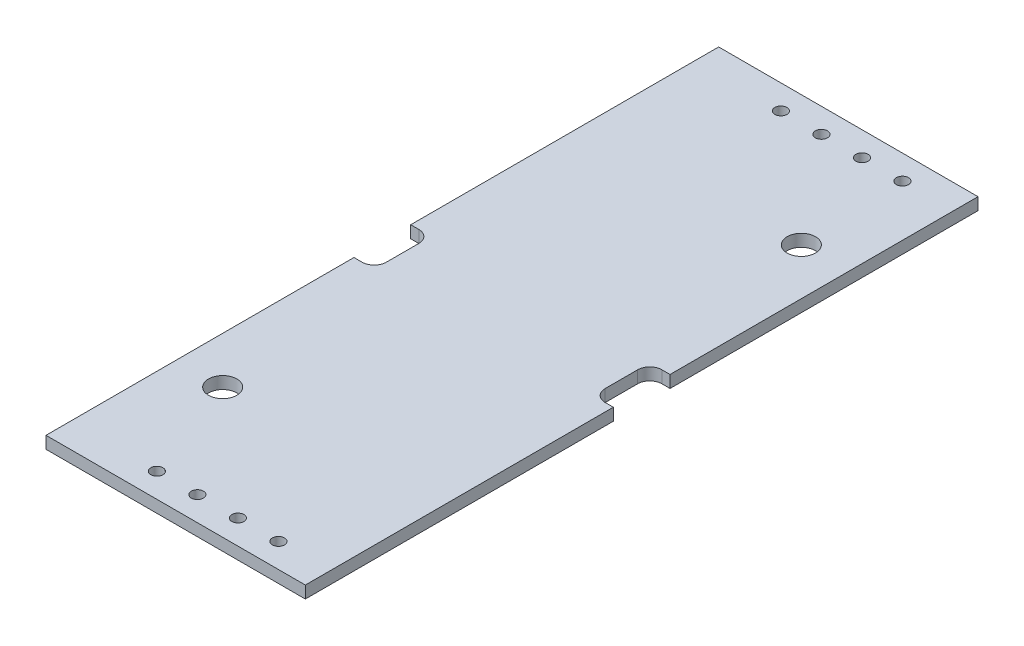
ISO-10303-21;
HEADER;
FILE_DESCRIPTION(('STEP AP214'),'2;1');
FILE_NAME('part.step','',(''),(''),'','','');
FILE_SCHEMA(('AUTOMOTIVE_DESIGN { 1 0 10303 214 1 1 1 1 }'));
ENDSEC;
DATA;
#1=APPLICATION_CONTEXT('core data for automotive mechanical design processes');
#2=APPLICATION_PROTOCOL_DEFINITION('international standard','automotive_design',2000,#1);
#3=PRODUCT_CONTEXT('',#1,'mechanical');
#4=PRODUCT('Part','Part','',(#3));
#5=PRODUCT_RELATED_PRODUCT_CATEGORY('part','',(#4));
#6=PRODUCT_DEFINITION_FORMATION('','',#4);
#7=PRODUCT_DEFINITION_CONTEXT('part definition',#1,'design');
#8=PRODUCT_DEFINITION('design','',#6,#7);
#9=PRODUCT_DEFINITION_SHAPE('','',#8);
#10=(LENGTH_UNIT() NAMED_UNIT(*) SI_UNIT(.MILLI.,.METRE.));
#11=(NAMED_UNIT(*) PLANE_ANGLE_UNIT() SI_UNIT($,.RADIAN.));
#12=(NAMED_UNIT(*) SI_UNIT($,.STERADIAN.) SOLID_ANGLE_UNIT());
#13=UNCERTAINTY_MEASURE_WITH_UNIT(LENGTH_MEASURE(1.E-05),#10,'distance_accuracy_value','');
#14=(GEOMETRIC_REPRESENTATION_CONTEXT(3) GLOBAL_UNCERTAINTY_ASSIGNED_CONTEXT((#13)) GLOBAL_UNIT_ASSIGNED_CONTEXT((#10,
#11,#12)) REPRESENTATION_CONTEXT('',''));
#15=CARTESIAN_POINT('',(0.,0.,0.));
#16=DIRECTION('',(0.,0.,1.));
#17=DIRECTION('',(1.,0.,0.));
#18=AXIS2_PLACEMENT_3D('',#15,#16,#17);
#19=CARTESIAN_POINT('',(-15.,0.,-2.));
#20=DIRECTION('',(0.,-1.,0.));
#21=DIRECTION('',(0.,0.,-1.));
#22=AXIS2_PLACEMENT_3D('',#19,#20,#21);
#23=PLANE('',#22);
#24=CARTESIAN_POINT('',(-5.32,0.,38.5));
#25=DIRECTION('',(0.,1.,0.));
#26=DIRECTION('',(0.,0.,1.));
#27=AXIS2_PLACEMENT_3D('',#24,#25,#26);
#28=CIRCLE('',#27,0.750000000000015);
#29=CARTESIAN_POINT('',(-5.32,0.,39.25));
#30=VERTEX_POINT('',#29);
#31=EDGE_CURVE('E356',#30,#30,#28,.T.);
#32=ORIENTED_EDGE('',*,*,#31,.T.);
#33=EDGE_LOOP('',(#32));
#34=FACE_BOUND('',#33,.T.);
#35=CARTESIAN_POINT('',(-0.320000000000001,0.,38.5));
#36=DIRECTION('',(0.,1.,0.));
#37=DIRECTION('',(0.,0.,1.));
#38=AXIS2_PLACEMENT_3D('',#35,#36,#37);
#39=CIRCLE('',#38,0.750000000000015);
#40=CARTESIAN_POINT('',(-0.320000000000001,0.,39.25));
#41=VERTEX_POINT('',#40);
#42=EDGE_CURVE('E360',#41,#41,#39,.T.);
#43=ORIENTED_EDGE('',*,*,#42,.T.);
#44=EDGE_LOOP('',(#43));
#45=FACE_BOUND('',#44,.T.);
#46=CARTESIAN_POINT('',(4.68,0.,38.5));
#47=DIRECTION('',(0.,1.,0.));
#48=DIRECTION('',(0.,0.,1.));
#49=AXIS2_PLACEMENT_3D('',#46,#47,#48);
#50=CIRCLE('',#49,0.750000000000015);
#51=CARTESIAN_POINT('',(4.68,0.,39.25));
#52=VERTEX_POINT('',#51);
#53=EDGE_CURVE('E369',#52,#52,#50,.T.);
#54=ORIENTED_EDGE('',*,*,#53,.T.);
#55=EDGE_LOOP('',(#54));
#56=FACE_BOUND('',#55,.T.);
#57=CARTESIAN_POINT('',(-5.32,0.,-38.5));
#58=DIRECTION('',(0.,1.,0.));
#59=DIRECTION('',(0.,0.,1.));
#60=AXIS2_PLACEMENT_3D('',#57,#58,#59);
#61=CIRCLE('',#60,0.750000000000015);
#62=CARTESIAN_POINT('',(-5.32,0.,-37.75));
#63=VERTEX_POINT('',#62);
#64=EDGE_CURVE('E375',#63,#63,#61,.T.);
#65=ORIENTED_EDGE('',*,*,#64,.T.);
#66=EDGE_LOOP('',(#65));
#67=FACE_BOUND('',#66,.T.);
#68=CARTESIAN_POINT('',(-0.320000000000001,0.,-38.5));
#69=DIRECTION('',(0.,1.,0.));
#70=DIRECTION('',(0.,0.,1.));
#71=AXIS2_PLACEMENT_3D('',#68,#69,#70);
#72=CIRCLE('',#71,0.750000000000015);
#73=CARTESIAN_POINT('',(-0.320000000000001,0.,-37.75));
#74=VERTEX_POINT('',#73);
#75=EDGE_CURVE('E381',#74,#74,#72,.T.);
#76=ORIENTED_EDGE('',*,*,#75,.T.);
#77=EDGE_LOOP('',(#76));
#78=FACE_BOUND('',#77,.T.);
#79=CARTESIAN_POINT('',(4.68,0.,-38.5));
#80=DIRECTION('',(0.,1.,0.));
#81=DIRECTION('',(0.,0.,1.));
#82=AXIS2_PLACEMENT_3D('',#79,#80,#81);
#83=CIRCLE('',#82,0.750000000000015);
#84=CARTESIAN_POINT('',(4.68,0.,-37.75));
#85=VERTEX_POINT('',#84);
#86=EDGE_CURVE('E387',#85,#85,#83,.T.);
#87=ORIENTED_EDGE('',*,*,#86,.T.);
#88=EDGE_LOOP('',(#87));
#89=FACE_BOUND('',#88,.T.);
#90=CARTESIAN_POINT('',(9.68,0.,-38.5));
#91=DIRECTION('',(0.,1.,0.));
#92=DIRECTION('',(0.,0.,1.));
#93=AXIS2_PLACEMENT_3D('',#90,#91,#92);
#94=CIRCLE('',#93,0.750000000000015);
#95=CARTESIAN_POINT('',(9.68,0.,-37.75));
#96=VERTEX_POINT('',#95);
#97=EDGE_CURVE('E396',#96,#96,#94,.T.);
#98=ORIENTED_EDGE('',*,*,#97,.T.);
#99=EDGE_LOOP('',(#98));
#100=FACE_BOUND('',#99,.T.);
#101=CARTESIAN_POINT('',(9.68,0.,38.5));
#102=DIRECTION('',(0.,1.,0.));
#103=DIRECTION('',(0.,0.,1.));
#104=AXIS2_PLACEMENT_3D('',#101,#102,#103);
#105=CIRCLE('',#104,0.750000000000015);
#106=CARTESIAN_POINT('',(9.68,0.,39.25));
#107=VERTEX_POINT('',#106);
#108=EDGE_CURVE('E402',#107,#107,#105,.T.);
#109=ORIENTED_EDGE('',*,*,#108,.T.);
#110=EDGE_LOOP('',(#109));
#111=FACE_BOUND('',#110,.T.);
#112=DIRECTION('',(0.,0.,1.));
#113=VECTOR('',#112,1.);
#114=CARTESIAN_POINT('',(-16.,0.,-41.5));
#115=LINE('',#114,#113);
#116=CARTESIAN_POINT('',(-16.,0.,-41.5));
#117=VERTEX_POINT('',#116);
#118=CARTESIAN_POINT('',(-16.,0.,-3.5));
#119=VERTEX_POINT('',#118);
#120=EDGE_CURVE('E175',#117,#119,#115,.T.);
#121=ORIENTED_EDGE('',*,*,#120,.F.);
#122=DIRECTION('',(-1.,0.,0.));
#123=VECTOR('',#122,1.);
#124=CARTESIAN_POINT('',(-16.,0.,-41.5));
#125=LINE('',#124,#123);
#126=CARTESIAN_POINT('',(16.,0.,-41.5));
#127=VERTEX_POINT('',#126);
#128=EDGE_CURVE('E106',#127,#117,#125,.T.);
#129=ORIENTED_EDGE('',*,*,#128,.F.);
#130=DIRECTION('',(0.,0.,-1.));
#131=VECTOR('',#130,1.);
#132=CARTESIAN_POINT('',(16.,0.,-41.5));
#133=LINE('',#132,#131);
#134=CARTESIAN_POINT('',(16.,0.,-3.5));
#135=VERTEX_POINT('',#134);
#136=EDGE_CURVE('E100',#135,#127,#133,.T.);
#137=ORIENTED_EDGE('',*,*,#136,.F.);
#138=DIRECTION('',(1.,0.,0.));
#139=VECTOR('',#138,1.);
#140=CARTESIAN_POINT('',(16.,0.,-3.5));
#141=LINE('',#140,#139);
#142=CARTESIAN_POINT('',(15.,0.,-3.5));
#143=VERTEX_POINT('',#142);
#144=EDGE_CURVE('E165',#143,#135,#141,.T.);
#145=ORIENTED_EDGE('',*,*,#144,.F.);
#146=CARTESIAN_POINT('',(15.,0.,-2.));
#147=DIRECTION('',(0.,-1.,0.));
#148=DIRECTION('',(0.,0.,1.));
#149=AXIS2_PLACEMENT_3D('',#146,#147,#148);
#150=CIRCLE('',#149,1.5);
#151=CARTESIAN_POINT('',(13.5,0.,-2.));
#152=VERTEX_POINT('',#151);
#153=EDGE_CURVE('E201',#152,#143,#150,.T.);
#154=ORIENTED_EDGE('',*,*,#153,.F.);
#155=DIRECTION('',(0.,0.,-1.));
#156=VECTOR('',#155,1.);
#157=CARTESIAN_POINT('',(13.5,0.,-2.));
#158=LINE('',#157,#156);
#159=CARTESIAN_POINT('',(13.5,0.,2.));
#160=VERTEX_POINT('',#159);
#161=EDGE_CURVE('E199',#160,#152,#158,.T.);
#162=ORIENTED_EDGE('',*,*,#161,.F.);
#163=CARTESIAN_POINT('',(15.,0.,2.));
#164=DIRECTION('',(0.,-1.,0.));
#165=DIRECTION('',(0.,0.,1.));
#166=AXIS2_PLACEMENT_3D('',#163,#164,#165);
#167=CIRCLE('',#166,1.5);
#168=CARTESIAN_POINT('',(15.,0.,3.5));
#169=VERTEX_POINT('',#168);
#170=EDGE_CURVE('E197',#169,#160,#167,.T.);
#171=ORIENTED_EDGE('',*,*,#170,.F.);
#172=DIRECTION('',(-1.,0.,0.));
#173=VECTOR('',#172,1.);
#174=CARTESIAN_POINT('',(15.,0.,3.5));
#175=LINE('',#174,#173);
#176=CARTESIAN_POINT('',(16.,0.,3.5));
#177=VERTEX_POINT('',#176);
#178=EDGE_CURVE('E195',#177,#169,#175,.T.);
#179=ORIENTED_EDGE('',*,*,#178,.F.);
#180=DIRECTION('',(0.,0.,-1.));
#181=VECTOR('',#180,1.);
#182=CARTESIAN_POINT('',(16.,0.,3.5));
#183=LINE('',#182,#181);
#184=CARTESIAN_POINT('',(16.,0.,41.5));
#185=VERTEX_POINT('',#184);
#186=EDGE_CURVE('E193',#185,#177,#183,.T.);
#187=ORIENTED_EDGE('',*,*,#186,.F.);
#188=DIRECTION('',(1.,0.,0.));
#189=VECTOR('',#188,1.);
#190=CARTESIAN_POINT('',(-16.,0.,41.5));
#191=LINE('',#190,#189);
#192=CARTESIAN_POINT('',(-16.,0.,41.5));
#193=VERTEX_POINT('',#192);
#194=EDGE_CURVE('E191',#193,#185,#191,.T.);
#195=ORIENTED_EDGE('',*,*,#194,.F.);
#196=DIRECTION('',(0.,0.,1.));
#197=VECTOR('',#196,1.);
#198=CARTESIAN_POINT('',(-16.,0.,3.5));
#199=LINE('',#198,#197);
#200=CARTESIAN_POINT('',(-16.,0.,3.5));
#201=VERTEX_POINT('',#200);
#202=EDGE_CURVE('E189',#201,#193,#199,.T.);
#203=ORIENTED_EDGE('',*,*,#202,.F.);
#204=DIRECTION('',(-1.,0.,0.));
#205=VECTOR('',#204,1.);
#206=CARTESIAN_POINT('',(-15.,0.,3.5));
#207=LINE('',#206,#205);
#208=CARTESIAN_POINT('',(-15.,0.,3.5));
#209=VERTEX_POINT('',#208);
#210=EDGE_CURVE('E187',#209,#201,#207,.T.);
#211=ORIENTED_EDGE('',*,*,#210,.F.);
#212=CARTESIAN_POINT('',(-15.,0.,2.));
#213=DIRECTION('',(0.,-1.,0.));
#214=DIRECTION('',(0.,0.,-1.));
#215=AXIS2_PLACEMENT_3D('',#212,#213,#214);
#216=CIRCLE('',#215,1.5);
#217=CARTESIAN_POINT('',(-13.5,0.,2.));
#218=VERTEX_POINT('',#217);
#219=EDGE_CURVE('E185',#218,#209,#216,.T.);
#220=ORIENTED_EDGE('',*,*,#219,.F.);
#221=DIRECTION('',(0.,0.,1.));
#222=VECTOR('',#221,1.);
#223=CARTESIAN_POINT('',(-13.5,0.,-2.));
#224=LINE('',#223,#222);
#225=CARTESIAN_POINT('',(-13.5,0.,-2.));
#226=VERTEX_POINT('',#225);
#227=EDGE_CURVE('E183',#226,#218,#224,.T.);
#228=ORIENTED_EDGE('',*,*,#227,.F.);
#229=CARTESIAN_POINT('',(-15.,0.,-2.));
#230=DIRECTION('',(0.,-1.,0.));
#231=DIRECTION('',(0.,0.,-1.));
#232=AXIS2_PLACEMENT_3D('',#229,#230,#231);
#233=CIRCLE('',#232,1.5);
#234=CARTESIAN_POINT('',(-15.,0.,-3.5));
#235=VERTEX_POINT('',#234);
#236=EDGE_CURVE('E181',#235,#226,#233,.T.);
#237=ORIENTED_EDGE('',*,*,#236,.F.);
#238=DIRECTION('',(1.,0.,0.));
#239=VECTOR('',#238,1.);
#240=CARTESIAN_POINT('',(-16.,0.,-3.5));
#241=LINE('',#240,#239);
#242=EDGE_CURVE('E178',#119,#235,#241,.T.);
#243=ORIENTED_EDGE('',*,*,#242,.F.);
#244=EDGE_LOOP('',(#121,#129,#137,#145,#154,#162,#171,#179,#187,#195,#203,#211,#220,#228,#237,#243));
#245=FACE_BOUND('',#244,.T.);
#246=CARTESIAN_POINT('',(-10.25,0.,25.45));
#247=DIRECTION('',(0.,1.,0.));
#248=DIRECTION('',(0.,0.,1.));
#249=AXIS2_PLACEMENT_3D('',#246,#247,#248);
#250=CIRCLE('',#249,1.75000000000001);
#251=CARTESIAN_POINT('',(-10.25,0.,27.2));
#252=VERTEX_POINT('',#251);
#253=EDGE_CURVE('E179',#252,#252,#250,.T.);
#254=ORIENTED_EDGE('',*,*,#253,.T.);
#255=EDGE_LOOP('',(#254));
#256=FACE_BOUND('',#255,.T.);
#257=CARTESIAN_POINT('',(10.25,0.,-25.45));
#258=DIRECTION('',(0.,1.,0.));
#259=DIRECTION('',(0.,0.,1.));
#260=AXIS2_PLACEMENT_3D('',#257,#258,#259);
#261=CIRCLE('',#260,1.75000000000001);
#262=CARTESIAN_POINT('',(10.25,0.,-23.7));
#263=VERTEX_POINT('',#262);
#264=EDGE_CURVE('E408',#263,#263,#261,.T.);
#265=ORIENTED_EDGE('',*,*,#264,.T.);
#266=EDGE_LOOP('',(#265));
#267=FACE_BOUND('',#266,.T.);
#268=ADVANCED_FACE('F30',(#34,#45,#56,#67,#78,#89,#100,#111,#245,#256,#267),#23,.T.);
#269=CARTESIAN_POINT('',(-16.,1.5,-41.5));
#270=DIRECTION('',(1.,0.,0.));
#271=DIRECTION('',(0.,0.,-1.));
#272=AXIS2_PLACEMENT_3D('',#269,#270,#271);
#273=PLANE('',#272);
#274=ORIENTED_EDGE('',*,*,#120,.T.);
#275=DIRECTION('',(0.,-1.,0.));
#276=VECTOR('',#275,1.);
#277=CARTESIAN_POINT('',(-16.,1.5,-3.5));
#278=LINE('',#277,#276);
#279=CARTESIAN_POINT('',(-16.,1.5,-3.5));
#280=VERTEX_POINT('',#279);
#281=EDGE_CURVE('E11',#280,#119,#278,.T.);
#282=ORIENTED_EDGE('',*,*,#281,.F.);
#283=DIRECTION('',(0.,0.,1.));
#284=VECTOR('',#283,1.);
#285=CARTESIAN_POINT('',(-16.,1.5,-41.5));
#286=LINE('',#285,#284);
#287=CARTESIAN_POINT('',(-16.,1.5,-41.5));
#288=VERTEX_POINT('',#287);
#289=EDGE_CURVE('E206',#288,#280,#286,.T.);
#290=ORIENTED_EDGE('',*,*,#289,.F.);
#291=DIRECTION('',(0.,-1.,0.));
#292=VECTOR('',#291,1.);
#293=CARTESIAN_POINT('',(-16.,1.5,-41.5));
#294=LINE('',#293,#292);
#295=EDGE_CURVE('E171',#288,#117,#294,.T.);
#296=ORIENTED_EDGE('',*,*,#295,.T.);
#297=EDGE_LOOP('',(#274,#282,#290,#296));
#298=FACE_BOUND('',#297,.T.);
#299=ADVANCED_FACE('F32',(#298),#273,.F.);
#300=CARTESIAN_POINT('',(-16.,1.5,-3.5));
#301=DIRECTION('',(0.,0.,-1.));
#302=DIRECTION('',(-1.,0.,0.));
#303=AXIS2_PLACEMENT_3D('',#300,#301,#302);
#304=PLANE('',#303);
#305=ORIENTED_EDGE('',*,*,#242,.T.);
#306=DIRECTION('',(0.,-1.,0.));
#307=VECTOR('',#306,1.);
#308=CARTESIAN_POINT('',(-15.,1.5,-3.5));
#309=LINE('',#308,#307);
#310=CARTESIAN_POINT('',(-15.,1.5,-3.5));
#311=VERTEX_POINT('',#310);
#312=EDGE_CURVE('E39',#311,#235,#309,.T.);
#313=ORIENTED_EDGE('',*,*,#312,.F.);
#314=DIRECTION('',(1.,0.,0.));
#315=VECTOR('',#314,1.);
#316=CARTESIAN_POINT('',(-16.,1.5,-3.5));
#317=LINE('',#316,#315);
#318=EDGE_CURVE('E114',#280,#311,#317,.T.);
#319=ORIENTED_EDGE('',*,*,#318,.F.);
#320=ORIENTED_EDGE('',*,*,#281,.T.);
#321=EDGE_LOOP('',(#305,#313,#319,#320));
#322=FACE_BOUND('',#321,.T.);
#323=ADVANCED_FACE('F310',(#322),#304,.F.);
#324=CARTESIAN_POINT('',(-15.,1.5,-2.));
#325=DIRECTION('',(0.,-1.,0.));
#326=DIRECTION('',(0.,0.,-1.));
#327=AXIS2_PLACEMENT_3D('',#324,#325,#326);
#328=CYLINDRICAL_SURFACE('',#327,1.5);
#329=ORIENTED_EDGE('',*,*,#236,.T.);
#330=DIRECTION('',(0.,-1.,0.));
#331=VECTOR('',#330,1.);
#332=CARTESIAN_POINT('',(-13.5,1.5,-2.));
#333=LINE('',#332,#331);
#334=CARTESIAN_POINT('',(-13.5,1.5,-2.));
#335=VERTEX_POINT('',#334);
#336=EDGE_CURVE('E237',#335,#226,#333,.T.);
#337=ORIENTED_EDGE('',*,*,#336,.F.);
#338=CARTESIAN_POINT('',(-15.,1.5,-2.));
#339=DIRECTION('',(0.,-1.,0.));
#340=DIRECTION('',(0.,0.,-1.));
#341=AXIS2_PLACEMENT_3D('',#338,#339,#340);
#342=CIRCLE('',#341,1.5);
#343=EDGE_CURVE('E245',#311,#335,#342,.T.);
#344=ORIENTED_EDGE('',*,*,#343,.F.);
#345=ORIENTED_EDGE('',*,*,#312,.T.);
#346=EDGE_LOOP('',(#329,#337,#344,#345));
#347=FACE_BOUND('',#346,.T.);
#348=ADVANCED_FACE('F243',(#347),#328,.F.);
#349=CARTESIAN_POINT('',(-13.5,1.5,-2.));
#350=DIRECTION('',(1.,0.,0.));
#351=DIRECTION('',(0.,0.,-1.));
#352=AXIS2_PLACEMENT_3D('',#349,#350,#351);
#353=PLANE('',#352);
#354=ORIENTED_EDGE('',*,*,#227,.T.);
#355=DIRECTION('',(0.,-1.,0.));
#356=VECTOR('',#355,1.);
#357=CARTESIAN_POINT('',(-13.5,1.5,2.));
#358=LINE('',#357,#356);
#359=CARTESIAN_POINT('',(-13.5,1.5,2.));
#360=VERTEX_POINT('',#359);
#361=EDGE_CURVE('E234',#360,#218,#358,.T.);
#362=ORIENTED_EDGE('',*,*,#361,.F.);
#363=DIRECTION('',(0.,0.,1.));
#364=VECTOR('',#363,1.);
#365=CARTESIAN_POINT('',(-13.5,1.5,-2.));
#366=LINE('',#365,#364);
#367=EDGE_CURVE('E263',#335,#360,#366,.T.);
#368=ORIENTED_EDGE('',*,*,#367,.F.);
#369=ORIENTED_EDGE('',*,*,#336,.T.);
#370=EDGE_LOOP('',(#354,#362,#368,#369));
#371=FACE_BOUND('',#370,.T.);
#372=ADVANCED_FACE('F254',(#371),#353,.F.);
#373=CARTESIAN_POINT('',(-15.,1.5,2.));
#374=DIRECTION('',(0.,-1.,0.));
#375=DIRECTION('',(0.,0.,-1.));
#376=AXIS2_PLACEMENT_3D('',#373,#374,#375);
#377=CYLINDRICAL_SURFACE('',#376,1.5);
#378=ORIENTED_EDGE('',*,*,#219,.T.);
#379=DIRECTION('',(0.,-1.,0.));
#380=VECTOR('',#379,1.);
#381=CARTESIAN_POINT('',(-15.,1.5,3.5));
#382=LINE('',#381,#380);
#383=CARTESIAN_POINT('',(-15.,1.5,3.5));
#384=VERTEX_POINT('',#383);
#385=EDGE_CURVE('E231',#384,#209,#382,.T.);
#386=ORIENTED_EDGE('',*,*,#385,.F.);
#387=CARTESIAN_POINT('',(-15.,1.5,2.));
#388=DIRECTION('',(0.,-1.,0.));
#389=DIRECTION('',(0.,0.,-1.));
#390=AXIS2_PLACEMENT_3D('',#387,#388,#389);
#391=CIRCLE('',#390,1.5);
#392=EDGE_CURVE('E260',#360,#384,#391,.T.);
#393=ORIENTED_EDGE('',*,*,#392,.F.);
#394=ORIENTED_EDGE('',*,*,#361,.T.);
#395=EDGE_LOOP('',(#378,#386,#393,#394));
#396=FACE_BOUND('',#395,.T.);
#397=ADVANCED_FACE('F258',(#396),#377,.F.);
#398=CARTESIAN_POINT('',(-15.,1.5,3.5));
#399=DIRECTION('',(0.,0.,1.));
#400=DIRECTION('',(1.,0.,0.));
#401=AXIS2_PLACEMENT_3D('',#398,#399,#400);
#402=PLANE('',#401);
#403=ORIENTED_EDGE('',*,*,#210,.T.);
#404=DIRECTION('',(0.,-1.,0.));
#405=VECTOR('',#404,1.);
#406=CARTESIAN_POINT('',(-16.,1.5,3.5));
#407=LINE('',#406,#405);
#408=CARTESIAN_POINT('',(-16.,1.5,3.5));
#409=VERTEX_POINT('',#408);
#410=EDGE_CURVE('E228',#409,#201,#407,.T.);
#411=ORIENTED_EDGE('',*,*,#410,.F.);
#412=DIRECTION('',(-1.,0.,0.));
#413=VECTOR('',#412,1.);
#414=CARTESIAN_POINT('',(-15.,1.5,3.5));
#415=LINE('',#414,#413);
#416=EDGE_CURVE('E262',#384,#409,#415,.T.);
#417=ORIENTED_EDGE('',*,*,#416,.F.);
#418=ORIENTED_EDGE('',*,*,#385,.T.);
#419=EDGE_LOOP('',(#403,#411,#417,#418));
#420=FACE_BOUND('',#419,.T.);
#421=ADVANCED_FACE('F585',(#420),#402,.F.);
#422=CARTESIAN_POINT('',(-16.,1.5,3.5));
#423=DIRECTION('',(1.,0.,0.));
#424=DIRECTION('',(0.,0.,-1.));
#425=AXIS2_PLACEMENT_3D('',#422,#423,#424);
#426=PLANE('',#425);
#427=ORIENTED_EDGE('',*,*,#202,.T.);
#428=DIRECTION('',(0.,-1.,0.));
#429=VECTOR('',#428,1.);
#430=CARTESIAN_POINT('',(-16.,1.5,41.5));
#431=LINE('',#430,#429);
#432=CARTESIAN_POINT('',(-16.,1.5,41.5));
#433=VERTEX_POINT('',#432);
#434=EDGE_CURVE('E225',#433,#193,#431,.T.);
#435=ORIENTED_EDGE('',*,*,#434,.F.);
#436=DIRECTION('',(0.,0.,1.));
#437=VECTOR('',#436,1.);
#438=CARTESIAN_POINT('',(-16.,1.5,3.5));
#439=LINE('',#438,#437);
#440=EDGE_CURVE('E265',#409,#433,#439,.T.);
#441=ORIENTED_EDGE('',*,*,#440,.F.);
#442=ORIENTED_EDGE('',*,*,#410,.T.);
#443=EDGE_LOOP('',(#427,#435,#441,#442));
#444=FACE_BOUND('',#443,.T.);
#445=ADVANCED_FACE('F575',(#444),#426,.F.);
#446=CARTESIAN_POINT('',(-16.,1.5,41.5));
#447=DIRECTION('',(0.,0.,-1.));
#448=DIRECTION('',(-1.,0.,0.));
#449=AXIS2_PLACEMENT_3D('',#446,#447,#448);
#450=PLANE('',#449);
#451=ORIENTED_EDGE('',*,*,#194,.T.);
#452=DIRECTION('',(0.,-1.,0.));
#453=VECTOR('',#452,1.);
#454=CARTESIAN_POINT('',(16.,1.5,41.5));
#455=LINE('',#454,#453);
#456=CARTESIAN_POINT('',(16.,1.5,41.5));
#457=VERTEX_POINT('',#456);
#458=EDGE_CURVE('E222',#457,#185,#455,.T.);
#459=ORIENTED_EDGE('',*,*,#458,.F.);
#460=DIRECTION('',(1.,0.,0.));
#461=VECTOR('',#460,1.);
#462=CARTESIAN_POINT('',(-16.,1.5,41.5));
#463=LINE('',#462,#461);
#464=EDGE_CURVE('E271',#433,#457,#463,.T.);
#465=ORIENTED_EDGE('',*,*,#464,.F.);
#466=ORIENTED_EDGE('',*,*,#434,.T.);
#467=EDGE_LOOP('',(#451,#459,#465,#466));
#468=FACE_BOUND('',#467,.T.);
#469=ADVANCED_FACE('F565',(#468),#450,.F.);
#470=CARTESIAN_POINT('',(16.,1.5,3.5));
#471=DIRECTION('',(-1.,0.,0.));
#472=DIRECTION('',(0.,0.,1.));
#473=AXIS2_PLACEMENT_3D('',#470,#471,#472);
#474=PLANE('',#473);
#475=ORIENTED_EDGE('',*,*,#186,.T.);
#476=DIRECTION('',(0.,-1.,0.));
#477=VECTOR('',#476,1.);
#478=CARTESIAN_POINT('',(16.,1.5,3.5));
#479=LINE('',#478,#477);
#480=CARTESIAN_POINT('',(16.,1.5,3.5));
#481=VERTEX_POINT('',#480);
#482=EDGE_CURVE('E219',#481,#177,#479,.T.);
#483=ORIENTED_EDGE('',*,*,#482,.F.);
#484=DIRECTION('',(0.,0.,-1.));
#485=VECTOR('',#484,1.);
#486=CARTESIAN_POINT('',(16.,1.5,3.5));
#487=LINE('',#486,#485);
#488=EDGE_CURVE('E273',#457,#481,#487,.T.);
#489=ORIENTED_EDGE('',*,*,#488,.F.);
#490=ORIENTED_EDGE('',*,*,#458,.T.);
#491=EDGE_LOOP('',(#475,#483,#489,#490));
#492=FACE_BOUND('',#491,.T.);
#493=ADVANCED_FACE('F555',(#492),#474,.F.);
#494=CARTESIAN_POINT('',(15.,1.5,3.5));
#495=DIRECTION('',(0.,0.,1.));
#496=DIRECTION('',(1.,0.,0.));
#497=AXIS2_PLACEMENT_3D('',#494,#495,#496);
#498=PLANE('',#497);
#499=ORIENTED_EDGE('',*,*,#178,.T.);
#500=DIRECTION('',(0.,-1.,0.));
#501=VECTOR('',#500,1.);
#502=CARTESIAN_POINT('',(15.,1.5,3.5));
#503=LINE('',#502,#501);
#504=CARTESIAN_POINT('',(15.,1.5,3.5));
#505=VERTEX_POINT('',#504);
#506=EDGE_CURVE('E216',#505,#169,#503,.T.);
#507=ORIENTED_EDGE('',*,*,#506,.F.);
#508=DIRECTION('',(-1.,0.,0.));
#509=VECTOR('',#508,1.);
#510=CARTESIAN_POINT('',(15.,1.5,3.5));
#511=LINE('',#510,#509);
#512=EDGE_CURVE('E275',#481,#505,#511,.T.);
#513=ORIENTED_EDGE('',*,*,#512,.F.);
#514=ORIENTED_EDGE('',*,*,#482,.T.);
#515=EDGE_LOOP('',(#499,#507,#513,#514));
#516=FACE_BOUND('',#515,.T.);
#517=ADVANCED_FACE('F545',(#516),#498,.F.);
#518=CARTESIAN_POINT('',(15.,1.5,2.));
#519=DIRECTION('',(0.,-1.,0.));
#520=DIRECTION('',(0.,0.,-1.));
#521=AXIS2_PLACEMENT_3D('',#518,#519,#520);
#522=CYLINDRICAL_SURFACE('',#521,1.5);
#523=ORIENTED_EDGE('',*,*,#170,.T.);
#524=DIRECTION('',(0.,-1.,0.));
#525=VECTOR('',#524,1.);
#526=CARTESIAN_POINT('',(13.5,1.5,2.));
#527=LINE('',#526,#525);
#528=CARTESIAN_POINT('',(13.5,1.5,2.));
#529=VERTEX_POINT('',#528);
#530=EDGE_CURVE('E213',#529,#160,#527,.T.);
#531=ORIENTED_EDGE('',*,*,#530,.F.);
#532=CARTESIAN_POINT('',(15.,1.5,2.));
#533=DIRECTION('',(0.,-1.,0.));
#534=DIRECTION('',(0.,0.,1.));
#535=AXIS2_PLACEMENT_3D('',#532,#533,#534);
#536=CIRCLE('',#535,1.5);
#537=EDGE_CURVE('E277',#505,#529,#536,.T.);
#538=ORIENTED_EDGE('',*,*,#537,.F.);
#539=ORIENTED_EDGE('',*,*,#506,.T.);
#540=EDGE_LOOP('',(#523,#531,#538,#539));
#541=FACE_BOUND('',#540,.T.);
#542=ADVANCED_FACE('F536',(#541),#522,.F.);
#543=CARTESIAN_POINT('',(13.5,1.5,-2.));
#544=DIRECTION('',(-1.,0.,0.));
#545=DIRECTION('',(0.,0.,1.));
#546=AXIS2_PLACEMENT_3D('',#543,#544,#545);
#547=PLANE('',#546);
#548=ORIENTED_EDGE('',*,*,#161,.T.);
#549=DIRECTION('',(0.,-1.,0.));
#550=VECTOR('',#549,1.);
#551=CARTESIAN_POINT('',(13.5,1.5,-2.));
#552=LINE('',#551,#550);
#553=CARTESIAN_POINT('',(13.5,1.5,-2.));
#554=VERTEX_POINT('',#553);
#555=EDGE_CURVE('E210',#554,#152,#552,.T.);
#556=ORIENTED_EDGE('',*,*,#555,.F.);
#557=DIRECTION('',(0.,0.,-1.));
#558=VECTOR('',#557,1.);
#559=CARTESIAN_POINT('',(13.5,1.5,-2.));
#560=LINE('',#559,#558);
#561=EDGE_CURVE('E279',#529,#554,#560,.T.);
#562=ORIENTED_EDGE('',*,*,#561,.F.);
#563=ORIENTED_EDGE('',*,*,#530,.T.);
#564=EDGE_LOOP('',(#548,#556,#562,#563));
#565=FACE_BOUND('',#564,.T.);
#566=ADVANCED_FACE('F285',(#565),#547,.F.);
#567=CARTESIAN_POINT('',(15.,1.5,-2.));
#568=DIRECTION('',(0.,-1.,0.));
#569=DIRECTION('',(0.,0.,-1.));
#570=AXIS2_PLACEMENT_3D('',#567,#568,#569);
#571=CYLINDRICAL_SURFACE('',#570,1.5);
#572=ORIENTED_EDGE('',*,*,#153,.T.);
#573=DIRECTION('',(0.,-1.,0.));
#574=VECTOR('',#573,1.);
#575=CARTESIAN_POINT('',(15.,1.5,-3.5));
#576=LINE('',#575,#574);
#577=CARTESIAN_POINT('',(15.,1.5,-3.5));
#578=VERTEX_POINT('',#577);
#579=EDGE_CURVE('E166',#578,#143,#576,.T.);
#580=ORIENTED_EDGE('',*,*,#579,.F.);
#581=CARTESIAN_POINT('',(15.,1.5,-2.));
#582=DIRECTION('',(0.,-1.,0.));
#583=DIRECTION('',(0.,0.,1.));
#584=AXIS2_PLACEMENT_3D('',#581,#582,#583);
#585=CIRCLE('',#584,1.5);
#586=EDGE_CURVE('E157',#554,#578,#585,.T.);
#587=ORIENTED_EDGE('',*,*,#586,.F.);
#588=ORIENTED_EDGE('',*,*,#555,.T.);
#589=EDGE_LOOP('',(#572,#580,#587,#588));
#590=FACE_BOUND('',#589,.T.);
#591=ADVANCED_FACE('F289',(#590),#571,.F.);
#592=CARTESIAN_POINT('',(16.,1.5,-3.5));
#593=DIRECTION('',(0.,0.,-1.));
#594=DIRECTION('',(-1.,0.,0.));
#595=AXIS2_PLACEMENT_3D('',#592,#593,#594);
#596=PLANE('',#595);
#597=ORIENTED_EDGE('',*,*,#144,.T.);
#598=DIRECTION('',(0.,-1.,0.));
#599=VECTOR('',#598,1.);
#600=CARTESIAN_POINT('',(16.,1.5,-3.5));
#601=LINE('',#600,#599);
#602=CARTESIAN_POINT('',(16.,1.5,-3.5));
#603=VERTEX_POINT('',#602);
#604=EDGE_CURVE('E162',#603,#135,#601,.T.);
#605=ORIENTED_EDGE('',*,*,#604,.F.);
#606=DIRECTION('',(1.,0.,0.));
#607=VECTOR('',#606,1.);
#608=CARTESIAN_POINT('',(16.,1.5,-3.5));
#609=LINE('',#608,#607);
#610=EDGE_CURVE('E151',#578,#603,#609,.T.);
#611=ORIENTED_EDGE('',*,*,#610,.F.);
#612=ORIENTED_EDGE('',*,*,#579,.T.);
#613=EDGE_LOOP('',(#597,#605,#611,#612));
#614=FACE_BOUND('',#613,.T.);
#615=ADVANCED_FACE('F163',(#614),#596,.F.);
#616=CARTESIAN_POINT('',(16.,1.5,-41.5));
#617=DIRECTION('',(-1.,0.,0.));
#618=DIRECTION('',(0.,0.,1.));
#619=AXIS2_PLACEMENT_3D('',#616,#617,#618);
#620=PLANE('',#619);
#621=ORIENTED_EDGE('',*,*,#136,.T.);
#622=DIRECTION('',(0.,-1.,0.));
#623=VECTOR('',#622,1.);
#624=CARTESIAN_POINT('',(16.,1.5,-41.5));
#625=LINE('',#624,#623);
#626=CARTESIAN_POINT('',(16.,1.5,-41.5));
#627=VERTEX_POINT('',#626);
#628=EDGE_CURVE('E167',#627,#127,#625,.T.);
#629=ORIENTED_EDGE('',*,*,#628,.F.);
#630=DIRECTION('',(0.,0.,-1.));
#631=VECTOR('',#630,1.);
#632=CARTESIAN_POINT('',(16.,1.5,-41.5));
#633=LINE('',#632,#631);
#634=EDGE_CURVE('E155',#603,#627,#633,.T.);
#635=ORIENTED_EDGE('',*,*,#634,.F.);
#636=ORIENTED_EDGE('',*,*,#604,.T.);
#637=EDGE_LOOP('',(#621,#629,#635,#636));
#638=FACE_BOUND('',#637,.T.);
#639=ADVANCED_FACE('F169',(#638),#620,.F.);
#640=CARTESIAN_POINT('',(-16.,1.5,-41.5));
#641=DIRECTION('',(0.,0.,1.));
#642=DIRECTION('',(1.,0.,0.));
#643=AXIS2_PLACEMENT_3D('',#640,#641,#642);
#644=PLANE('',#643);
#645=ORIENTED_EDGE('',*,*,#128,.T.);
#646=ORIENTED_EDGE('',*,*,#295,.F.);
#647=DIRECTION('',(-1.,0.,0.));
#648=VECTOR('',#647,1.);
#649=CARTESIAN_POINT('',(-16.,1.5,-41.5));
#650=LINE('',#649,#648);
#651=EDGE_CURVE('E47',#627,#288,#650,.T.);
#652=ORIENTED_EDGE('',*,*,#651,.F.);
#653=ORIENTED_EDGE('',*,*,#628,.T.);
#654=EDGE_LOOP('',(#645,#646,#652,#653));
#655=FACE_BOUND('',#654,.T.);
#656=ADVANCED_FACE('F293',(#655),#644,.F.);
#657=CARTESIAN_POINT('',(-15.,1.5,-2.));
#658=DIRECTION('',(0.,-1.,0.));
#659=DIRECTION('',(0.,0.,-1.));
#660=AXIS2_PLACEMENT_3D('',#657,#658,#659);
#661=PLANE('',#660);
#662=CARTESIAN_POINT('',(-5.32,1.5,38.5));
#663=DIRECTION('',(0.,1.,0.));
#664=DIRECTION('',(0.,0.,1.));
#665=AXIS2_PLACEMENT_3D('',#662,#663,#664);
#666=CIRCLE('',#665,0.750000000000015);
#667=CARTESIAN_POINT('',(-5.32,1.5,39.25));
#668=VERTEX_POINT('',#667);
#669=EDGE_CURVE('E359',#668,#668,#666,.T.);
#670=ORIENTED_EDGE('',*,*,#669,.F.);
#671=EDGE_LOOP('',(#670));
#672=FACE_BOUND('',#671,.T.);
#673=CARTESIAN_POINT('',(-0.320000000000001,1.5,38.5));
#674=DIRECTION('',(0.,1.,0.));
#675=DIRECTION('',(0.,0.,1.));
#676=AXIS2_PLACEMENT_3D('',#673,#674,#675);
#677=CIRCLE('',#676,0.750000000000015);
#678=CARTESIAN_POINT('',(-0.320000000000001,1.5,39.25));
#679=VERTEX_POINT('',#678);
#680=EDGE_CURVE('E363',#679,#679,#677,.T.);
#681=ORIENTED_EDGE('',*,*,#680,.F.);
#682=EDGE_LOOP('',(#681));
#683=FACE_BOUND('',#682,.T.);
#684=CARTESIAN_POINT('',(4.68,1.5,38.5));
#685=DIRECTION('',(0.,1.,0.));
#686=DIRECTION('',(0.,0.,1.));
#687=AXIS2_PLACEMENT_3D('',#684,#685,#686);
#688=CIRCLE('',#687,0.750000000000015);
#689=CARTESIAN_POINT('',(4.68,1.5,39.25));
#690=VERTEX_POINT('',#689);
#691=EDGE_CURVE('E372',#690,#690,#688,.T.);
#692=ORIENTED_EDGE('',*,*,#691,.F.);
#693=EDGE_LOOP('',(#692));
#694=FACE_BOUND('',#693,.T.);
#695=CARTESIAN_POINT('',(-5.32,1.5,-38.5));
#696=DIRECTION('',(0.,1.,0.));
#697=DIRECTION('',(0.,0.,1.));
#698=AXIS2_PLACEMENT_3D('',#695,#696,#697);
#699=CIRCLE('',#698,0.750000000000015);
#700=CARTESIAN_POINT('',(-5.32,1.5,-37.75));
#701=VERTEX_POINT('',#700);
#702=EDGE_CURVE('E378',#701,#701,#699,.T.);
#703=ORIENTED_EDGE('',*,*,#702,.F.);
#704=EDGE_LOOP('',(#703));
#705=FACE_BOUND('',#704,.T.);
#706=CARTESIAN_POINT('',(-0.320000000000001,1.5,-38.5));
#707=DIRECTION('',(0.,1.,0.));
#708=DIRECTION('',(0.,0.,1.));
#709=AXIS2_PLACEMENT_3D('',#706,#707,#708);
#710=CIRCLE('',#709,0.750000000000015);
#711=CARTESIAN_POINT('',(-0.320000000000001,1.5,-37.75));
#712=VERTEX_POINT('',#711);
#713=EDGE_CURVE('E384',#712,#712,#710,.T.);
#714=ORIENTED_EDGE('',*,*,#713,.F.);
#715=EDGE_LOOP('',(#714));
#716=FACE_BOUND('',#715,.T.);
#717=CARTESIAN_POINT('',(4.68,1.5,-38.5));
#718=DIRECTION('',(0.,1.,0.));
#719=DIRECTION('',(0.,0.,1.));
#720=AXIS2_PLACEMENT_3D('',#717,#718,#719);
#721=CIRCLE('',#720,0.750000000000015);
#722=CARTESIAN_POINT('',(4.68,1.5,-37.75));
#723=VERTEX_POINT('',#722);
#724=EDGE_CURVE('E390',#723,#723,#721,.T.);
#725=ORIENTED_EDGE('',*,*,#724,.F.);
#726=EDGE_LOOP('',(#725));
#727=FACE_BOUND('',#726,.T.);
#728=CARTESIAN_POINT('',(9.68,1.5,-38.5));
#729=DIRECTION('',(0.,1.,0.));
#730=DIRECTION('',(0.,0.,1.));
#731=AXIS2_PLACEMENT_3D('',#728,#729,#730);
#732=CIRCLE('',#731,0.750000000000015);
#733=CARTESIAN_POINT('',(9.68,1.5,-37.75));
#734=VERTEX_POINT('',#733);
#735=EDGE_CURVE('E393',#734,#734,#732,.T.);
#736=ORIENTED_EDGE('',*,*,#735,.F.);
#737=EDGE_LOOP('',(#736));
#738=FACE_BOUND('',#737,.T.);
#739=CARTESIAN_POINT('',(9.68,1.5,38.5));
#740=DIRECTION('',(0.,1.,0.));
#741=DIRECTION('',(0.,0.,1.));
#742=AXIS2_PLACEMENT_3D('',#739,#740,#741);
#743=CIRCLE('',#742,0.750000000000015);
#744=CARTESIAN_POINT('',(9.68,1.5,39.25));
#745=VERTEX_POINT('',#744);
#746=EDGE_CURVE('E399',#745,#745,#743,.T.);
#747=ORIENTED_EDGE('',*,*,#746,.F.);
#748=EDGE_LOOP('',(#747));
#749=FACE_BOUND('',#748,.T.);
#750=CARTESIAN_POINT('',(10.25,1.5,-25.45));
#751=DIRECTION('',(0.,1.,0.));
#752=DIRECTION('',(0.,0.,1.));
#753=AXIS2_PLACEMENT_3D('',#750,#751,#752);
#754=CIRCLE('',#753,1.75000000000001);
#755=CARTESIAN_POINT('',(10.25,1.5,-23.7));
#756=VERTEX_POINT('',#755);
#757=EDGE_CURVE('E405',#756,#756,#754,.T.);
#758=ORIENTED_EDGE('',*,*,#757,.F.);
#759=EDGE_LOOP('',(#758));
#760=FACE_BOUND('',#759,.T.);
#761=CARTESIAN_POINT('',(-10.25,1.5,25.45));
#762=DIRECTION('',(0.,1.,0.));
#763=DIRECTION('',(0.,0.,1.));
#764=AXIS2_PLACEMENT_3D('',#761,#762,#763);
#765=CIRCLE('',#764,1.75000000000001);
#766=CARTESIAN_POINT('',(-10.25,1.5,27.2));
#767=VERTEX_POINT('',#766);
#768=EDGE_CURVE('E411',#767,#767,#765,.T.);
#769=ORIENTED_EDGE('',*,*,#768,.F.);
#770=EDGE_LOOP('',(#769));
#771=FACE_BOUND('',#770,.T.);
#772=ORIENTED_EDGE('',*,*,#289,.T.);
#773=ORIENTED_EDGE('',*,*,#318,.T.);
#774=ORIENTED_EDGE('',*,*,#343,.T.);
#775=ORIENTED_EDGE('',*,*,#367,.T.);
#776=ORIENTED_EDGE('',*,*,#392,.T.);
#777=ORIENTED_EDGE('',*,*,#416,.T.);
#778=ORIENTED_EDGE('',*,*,#440,.T.);
#779=ORIENTED_EDGE('',*,*,#464,.T.);
#780=ORIENTED_EDGE('',*,*,#488,.T.);
#781=ORIENTED_EDGE('',*,*,#512,.T.);
#782=ORIENTED_EDGE('',*,*,#537,.T.);
#783=ORIENTED_EDGE('',*,*,#561,.T.);
#784=ORIENTED_EDGE('',*,*,#586,.T.);
#785=ORIENTED_EDGE('',*,*,#610,.T.);
#786=ORIENTED_EDGE('',*,*,#634,.T.);
#787=ORIENTED_EDGE('',*,*,#651,.T.);
#788=EDGE_LOOP('',(#772,#773,#774,#775,#776,#777,#778,#779,#780,#781,#782,#783,#784,#785,#786,#787));
#789=FACE_BOUND('',#788,.T.);
#790=ADVANCED_FACE('F153',(#672,#683,#694,#705,#716,#727,#738,#749,#760,#771,#789),#661,.F.);
#791=CARTESIAN_POINT('',(-10.25,1.5,25.45));
#792=DIRECTION('',(0.,1.,0.));
#793=DIRECTION('',(0.,0.,1.));
#794=AXIS2_PLACEMENT_3D('',#791,#792,#793);
#795=CYLINDRICAL_SURFACE('',#794,1.75000000000001);
#796=ORIENTED_EDGE('',*,*,#253,.F.);
#797=EDGE_LOOP('',(#796));
#798=FACE_BOUND('',#797,.T.);
#799=ORIENTED_EDGE('',*,*,#768,.T.);
#800=EDGE_LOOP('',(#799));
#801=FACE_BOUND('',#800,.T.);
#802=ADVANCED_FACE('F300',(#798,#801),#795,.F.);
#803=CARTESIAN_POINT('',(10.25,1.5,-25.45));
#804=DIRECTION('',(0.,1.,0.));
#805=DIRECTION('',(0.,0.,1.));
#806=AXIS2_PLACEMENT_3D('',#803,#804,#805);
#807=CYLINDRICAL_SURFACE('',#806,1.75000000000001);
#808=ORIENTED_EDGE('',*,*,#264,.F.);
#809=EDGE_LOOP('',(#808));
#810=FACE_BOUND('',#809,.T.);
#811=ORIENTED_EDGE('',*,*,#757,.T.);
#812=EDGE_LOOP('',(#811));
#813=FACE_BOUND('',#812,.T.);
#814=ADVANCED_FACE('F316',(#810,#813),#807,.F.);
#815=CARTESIAN_POINT('',(9.68,1.5,38.5));
#816=DIRECTION('',(0.,1.,0.));
#817=DIRECTION('',(0.,0.,1.));
#818=AXIS2_PLACEMENT_3D('',#815,#816,#817);
#819=CYLINDRICAL_SURFACE('',#818,0.750000000000015);
#820=ORIENTED_EDGE('',*,*,#108,.F.);
#821=EDGE_LOOP('',(#820));
#822=FACE_BOUND('',#821,.T.);
#823=ORIENTED_EDGE('',*,*,#746,.T.);
#824=EDGE_LOOP('',(#823));
#825=FACE_BOUND('',#824,.T.);
#826=ADVANCED_FACE('F320',(#822,#825),#819,.F.);
#827=CARTESIAN_POINT('',(9.68,1.5,-38.5));
#828=DIRECTION('',(0.,1.,0.));
#829=DIRECTION('',(0.,0.,1.));
#830=AXIS2_PLACEMENT_3D('',#827,#828,#829);
#831=CYLINDRICAL_SURFACE('',#830,0.750000000000015);
#832=ORIENTED_EDGE('',*,*,#97,.F.);
#833=EDGE_LOOP('',(#832));
#834=FACE_BOUND('',#833,.T.);
#835=ORIENTED_EDGE('',*,*,#735,.T.);
#836=EDGE_LOOP('',(#835));
#837=FACE_BOUND('',#836,.T.);
#838=ADVANCED_FACE('F324',(#834,#837),#831,.F.);
#839=CARTESIAN_POINT('',(4.68,1.5,-38.5));
#840=DIRECTION('',(0.,1.,0.));
#841=DIRECTION('',(0.,0.,1.));
#842=AXIS2_PLACEMENT_3D('',#839,#840,#841);
#843=CYLINDRICAL_SURFACE('',#842,0.750000000000015);
#844=ORIENTED_EDGE('',*,*,#86,.F.);
#845=EDGE_LOOP('',(#844));
#846=FACE_BOUND('',#845,.T.);
#847=ORIENTED_EDGE('',*,*,#724,.T.);
#848=EDGE_LOOP('',(#847));
#849=FACE_BOUND('',#848,.T.);
#850=ADVANCED_FACE('F328',(#846,#849),#843,.F.);
#851=CARTESIAN_POINT('',(-0.320000000000001,1.5,-38.5));
#852=DIRECTION('',(0.,1.,0.));
#853=DIRECTION('',(0.,0.,1.));
#854=AXIS2_PLACEMENT_3D('',#851,#852,#853);
#855=CYLINDRICAL_SURFACE('',#854,0.750000000000015);
#856=ORIENTED_EDGE('',*,*,#75,.F.);
#857=EDGE_LOOP('',(#856));
#858=FACE_BOUND('',#857,.T.);
#859=ORIENTED_EDGE('',*,*,#713,.T.);
#860=EDGE_LOOP('',(#859));
#861=FACE_BOUND('',#860,.T.);
#862=ADVANCED_FACE('F332',(#858,#861),#855,.F.);
#863=CARTESIAN_POINT('',(-5.32,1.5,-38.5));
#864=DIRECTION('',(0.,1.,0.));
#865=DIRECTION('',(0.,0.,1.));
#866=AXIS2_PLACEMENT_3D('',#863,#864,#865);
#867=CYLINDRICAL_SURFACE('',#866,0.750000000000015);
#868=ORIENTED_EDGE('',*,*,#64,.F.);
#869=EDGE_LOOP('',(#868));
#870=FACE_BOUND('',#869,.T.);
#871=ORIENTED_EDGE('',*,*,#702,.T.);
#872=EDGE_LOOP('',(#871));
#873=FACE_BOUND('',#872,.T.);
#874=ADVANCED_FACE('F336',(#870,#873),#867,.F.);
#875=CARTESIAN_POINT('',(4.68,1.5,38.5));
#876=DIRECTION('',(0.,1.,0.));
#877=DIRECTION('',(0.,0.,1.));
#878=AXIS2_PLACEMENT_3D('',#875,#876,#877);
#879=CYLINDRICAL_SURFACE('',#878,0.750000000000015);
#880=ORIENTED_EDGE('',*,*,#53,.F.);
#881=EDGE_LOOP('',(#880));
#882=FACE_BOUND('',#881,.T.);
#883=ORIENTED_EDGE('',*,*,#691,.T.);
#884=EDGE_LOOP('',(#883));
#885=FACE_BOUND('',#884,.T.);
#886=ADVANCED_FACE('F340',(#882,#885),#879,.F.);
#887=CARTESIAN_POINT('',(-0.320000000000001,1.5,38.5));
#888=DIRECTION('',(0.,1.,0.));
#889=DIRECTION('',(0.,0.,1.));
#890=AXIS2_PLACEMENT_3D('',#887,#888,#889);
#891=CYLINDRICAL_SURFACE('',#890,0.750000000000015);
#892=ORIENTED_EDGE('',*,*,#42,.F.);
#893=EDGE_LOOP('',(#892));
#894=FACE_BOUND('',#893,.T.);
#895=ORIENTED_EDGE('',*,*,#680,.T.);
#896=EDGE_LOOP('',(#895));
#897=FACE_BOUND('',#896,.T.);
#898=ADVANCED_FACE('F344',(#894,#897),#891,.F.);
#899=CARTESIAN_POINT('',(-5.32,1.5,38.5));
#900=DIRECTION('',(0.,1.,0.));
#901=DIRECTION('',(0.,0.,1.));
#902=AXIS2_PLACEMENT_3D('',#899,#900,#901);
#903=CYLINDRICAL_SURFACE('',#902,0.750000000000015);
#904=ORIENTED_EDGE('',*,*,#31,.F.);
#905=EDGE_LOOP('',(#904));
#906=FACE_BOUND('',#905,.T.);
#907=ORIENTED_EDGE('',*,*,#669,.T.);
#908=EDGE_LOOP('',(#907));
#909=FACE_BOUND('',#908,.T.);
#910=ADVANCED_FACE('F348',(#906,#909),#903,.F.);
#911=CLOSED_SHELL('',(#268,#299,#323,#348,#372,#397,#421,#445,#469,#493,#517,#542,#566,#591,
#615,#639,#656,#790,#802,#814,#826,#838,#850,#862,#874,#886,#898,#910));
#912=MANIFOLD_SOLID_BREP('B2',#911);
#913=ADVANCED_BREP_SHAPE_REPRESENTATION('',(#18,#912),#14);
#914=SHAPE_DEFINITION_REPRESENTATION(#9,#913);
ENDSEC;
END-ISO-10303-21;
